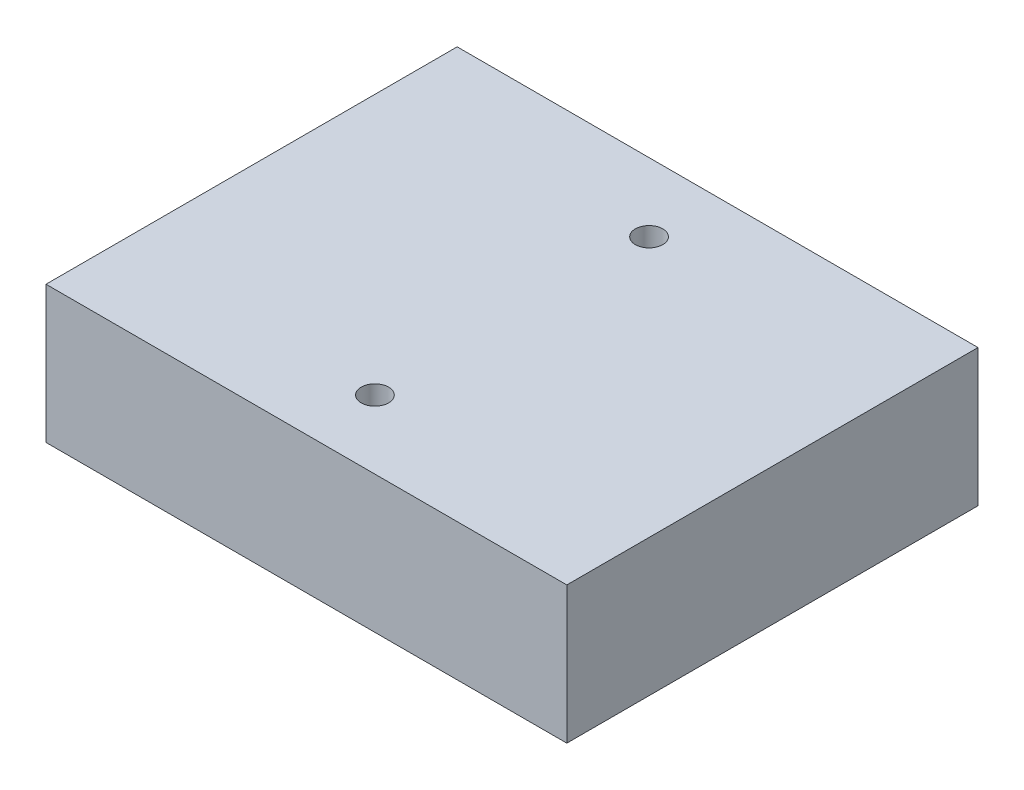
ISO-10303-21;
HEADER;
FILE_DESCRIPTION(('STEP AP214'),'2;1');
FILE_NAME('part.step','',(''),(''),'','','');
FILE_SCHEMA(('AUTOMOTIVE_DESIGN { 1 0 10303 214 1 1 1 1 }'));
ENDSEC;
DATA;
#1=APPLICATION_CONTEXT('core data for automotive mechanical design processes');
#2=APPLICATION_PROTOCOL_DEFINITION('international standard','automotive_design',2000,#1);
#3=PRODUCT_CONTEXT('',#1,'mechanical');
#4=PRODUCT('Part','Part','',(#3));
#5=PRODUCT_RELATED_PRODUCT_CATEGORY('part','',(#4));
#6=PRODUCT_DEFINITION_FORMATION('','',#4);
#7=PRODUCT_DEFINITION_CONTEXT('part definition',#1,'design');
#8=PRODUCT_DEFINITION('design','',#6,#7);
#9=PRODUCT_DEFINITION_SHAPE('','',#8);
#10=(LENGTH_UNIT() NAMED_UNIT(*) SI_UNIT(.MILLI.,.METRE.));
#11=(NAMED_UNIT(*) PLANE_ANGLE_UNIT() SI_UNIT($,.RADIAN.));
#12=(NAMED_UNIT(*) SI_UNIT($,.STERADIAN.) SOLID_ANGLE_UNIT());
#13=UNCERTAINTY_MEASURE_WITH_UNIT(LENGTH_MEASURE(1.E-05),#10,'distance_accuracy_value','');
#14=(GEOMETRIC_REPRESENTATION_CONTEXT(3) GLOBAL_UNCERTAINTY_ASSIGNED_CONTEXT((#13)) GLOBAL_UNIT_ASSIGNED_CONTEXT((#10,
#11,#12)) REPRESENTATION_CONTEXT('',''));
#15=CARTESIAN_POINT('',(0.,0.,0.));
#16=DIRECTION('',(0.,0.,1.));
#17=DIRECTION('',(1.,0.,0.));
#18=AXIS2_PLACEMENT_3D('',#15,#16,#17);
#19=CARTESIAN_POINT('',(0.,20.,0.));
#20=DIRECTION('',(0.,1.,0.));
#21=DIRECTION('',(0.,0.,1.));
#22=AXIS2_PLACEMENT_3D('',#19,#20,#21);
#23=PLANE('',#22);
#24=CARTESIAN_POINT('',(65.5142028985507,20.,-8.75130434782607));
#25=DIRECTION('',(0.,1.,0.));
#26=DIRECTION('',(0.,0.,1.));
#27=AXIS2_PLACEMENT_3D('',#24,#25,#26);
#28=CIRCLE('',#27,2.);
#29=CARTESIAN_POINT('',(65.5142028985507,20.,-6.75130434782607));
#30=VERTEX_POINT('',#29);
#31=EDGE_CURVE('E101',#30,#30,#28,.T.);
#32=ORIENTED_EDGE('',*,*,#31,.F.);
#33=EDGE_LOOP('',(#32));
#34=FACE_BOUND('',#33,.T.);
#35=DIRECTION('',(0.,0.,1.));
#36=VECTOR('',#35,1.);
#37=CARTESIAN_POINT('',(27.5142028985507,20.,-58.7513043478261));
#38=LINE('',#37,#36);
#39=CARTESIAN_POINT('',(27.5142028985507,20.,-58.7513043478261));
#40=VERTEX_POINT('',#39);
#41=CARTESIAN_POINT('',(27.5142028985507,20.,1.24869565217393));
#42=VERTEX_POINT('',#41);
#43=EDGE_CURVE('E86',#40,#42,#38,.T.);
#44=ORIENTED_EDGE('',*,*,#43,.T.);
#45=DIRECTION('',(1.,0.,0.));
#46=VECTOR('',#45,1.);
#47=CARTESIAN_POINT('',(27.5142028985507,20.,1.24869565217393));
#48=LINE('',#47,#46);
#49=CARTESIAN_POINT('',(103.514202898551,20.,1.24869565217393));
#50=VERTEX_POINT('',#49);
#51=EDGE_CURVE('E81',#42,#50,#48,.T.);
#52=ORIENTED_EDGE('',*,*,#51,.T.);
#53=DIRECTION('',(0.,0.,-1.));
#54=VECTOR('',#53,1.);
#55=CARTESIAN_POINT('',(103.514202898551,20.,-58.7513043478261));
#56=LINE('',#55,#54);
#57=CARTESIAN_POINT('',(103.514202898551,20.,-58.7513043478261));
#58=VERTEX_POINT('',#57);
#59=EDGE_CURVE('E84',#50,#58,#56,.T.);
#60=ORIENTED_EDGE('',*,*,#59,.T.);
#61=DIRECTION('',(-1.,0.,0.));
#62=VECTOR('',#61,1.);
#63=CARTESIAN_POINT('',(27.5142028985507,20.,-58.7513043478261));
#64=LINE('',#63,#62);
#65=EDGE_CURVE('E51',#58,#40,#64,.T.);
#66=ORIENTED_EDGE('',*,*,#65,.T.);
#67=EDGE_LOOP('',(#44,#52,#60,#66));
#68=FACE_BOUND('',#67,.T.);
#69=CARTESIAN_POINT('',(65.5142028985507,20.,-48.7513043478261));
#70=DIRECTION('',(0.,1.,0.));
#71=DIRECTION('',(0.,0.,1.));
#72=AXIS2_PLACEMENT_3D('',#69,#70,#71);
#73=CIRCLE('',#72,2.);
#74=CARTESIAN_POINT('',(65.5142028985507,20.,-46.7513043478261));
#75=VERTEX_POINT('',#74);
#76=EDGE_CURVE('E116',#75,#75,#73,.T.);
#77=ORIENTED_EDGE('',*,*,#76,.F.);
#78=EDGE_LOOP('',(#77));
#79=FACE_BOUND('',#78,.T.);
#80=ADVANCED_FACE('F34',(#34,#68,#79),#23,.T.);
#81=CARTESIAN_POINT('',(0.,0.,0.));
#82=DIRECTION('',(0.,1.,0.));
#83=DIRECTION('',(0.,0.,1.));
#84=AXIS2_PLACEMENT_3D('',#81,#82,#83);
#85=PLANE('',#84);
#86=DIRECTION('',(0.,0.,1.));
#87=VECTOR('',#86,1.);
#88=CARTESIAN_POINT('',(27.5142028985507,0.,-58.7513043478261));
#89=LINE('',#88,#87);
#90=CARTESIAN_POINT('',(27.5142028985507,0.,-58.7513043478261));
#91=VERTEX_POINT('',#90);
#92=CARTESIAN_POINT('',(27.5142028985507,0.,1.24869565217393));
#93=VERTEX_POINT('',#92);
#94=EDGE_CURVE('E98',#91,#93,#89,.T.);
#95=ORIENTED_EDGE('',*,*,#94,.F.);
#96=DIRECTION('',(-1.,0.,0.));
#97=VECTOR('',#96,1.);
#98=CARTESIAN_POINT('',(27.5142028985507,0.,-58.7513043478261));
#99=LINE('',#98,#97);
#100=CARTESIAN_POINT('',(103.514202898551,0.,-58.7513043478261));
#101=VERTEX_POINT('',#100);
#102=EDGE_CURVE('E74',#101,#91,#99,.T.);
#103=ORIENTED_EDGE('',*,*,#102,.F.);
#104=DIRECTION('',(0.,0.,-1.));
#105=VECTOR('',#104,1.);
#106=CARTESIAN_POINT('',(103.514202898551,0.,-58.7513043478261));
#107=LINE('',#106,#105);
#108=CARTESIAN_POINT('',(103.514202898551,0.,1.24869565217393));
#109=VERTEX_POINT('',#108);
#110=EDGE_CURVE('E68',#109,#101,#107,.T.);
#111=ORIENTED_EDGE('',*,*,#110,.F.);
#112=DIRECTION('',(1.,0.,0.));
#113=VECTOR('',#112,1.);
#114=CARTESIAN_POINT('',(27.5142028985507,0.,1.24869565217393));
#115=LINE('',#114,#113);
#116=EDGE_CURVE('E90',#93,#109,#115,.T.);
#117=ORIENTED_EDGE('',*,*,#116,.F.);
#118=EDGE_LOOP('',(#95,#103,#111,#117));
#119=FACE_BOUND('',#118,.T.);
#120=CARTESIAN_POINT('',(65.5142028985507,0.,-8.75130434782607));
#121=DIRECTION('',(0.,1.,0.));
#122=DIRECTION('',(0.,0.,1.));
#123=AXIS2_PLACEMENT_3D('',#120,#121,#122);
#124=CIRCLE('',#123,2.);
#125=CARTESIAN_POINT('',(65.5142028985507,0.,-6.75130434782607));
#126=VERTEX_POINT('',#125);
#127=EDGE_CURVE('E113',#126,#126,#124,.T.);
#128=ORIENTED_EDGE('',*,*,#127,.T.);
#129=EDGE_LOOP('',(#128));
#130=FACE_BOUND('',#129,.T.);
#131=CARTESIAN_POINT('',(65.5142028985507,0.,-48.7513043478261));
#132=DIRECTION('',(0.,1.,0.));
#133=DIRECTION('',(0.,0.,1.));
#134=AXIS2_PLACEMENT_3D('',#131,#132,#133);
#135=CIRCLE('',#134,2.);
#136=CARTESIAN_POINT('',(65.5142028985507,0.,-46.7513043478261));
#137=VERTEX_POINT('',#136);
#138=EDGE_CURVE('E119',#137,#137,#135,.T.);
#139=ORIENTED_EDGE('',*,*,#138,.T.);
#140=EDGE_LOOP('',(#139));
#141=FACE_BOUND('',#140,.T.);
#142=ADVANCED_FACE('F109',(#119,#130,#141),#85,.F.);
#143=CARTESIAN_POINT('',(27.5142028985507,20.,-58.7513043478261));
#144=DIRECTION('',(1.,0.,0.));
#145=DIRECTION('',(0.,0.,-1.));
#146=AXIS2_PLACEMENT_3D('',#143,#144,#145);
#147=PLANE('',#146);
#148=ORIENTED_EDGE('',*,*,#94,.T.);
#149=DIRECTION('',(0.,-1.,0.));
#150=VECTOR('',#149,1.);
#151=CARTESIAN_POINT('',(27.5142028985507,20.,1.24869565217393));
#152=LINE('',#151,#150);
#153=EDGE_CURVE('E11',#42,#93,#152,.T.);
#154=ORIENTED_EDGE('',*,*,#153,.F.);
#155=ORIENTED_EDGE('',*,*,#43,.F.);
#156=DIRECTION('',(0.,-1.,0.));
#157=VECTOR('',#156,1.);
#158=CARTESIAN_POINT('',(27.5142028985507,20.,-58.7513043478261));
#159=LINE('',#158,#157);
#160=EDGE_CURVE('E94',#40,#91,#159,.T.);
#161=ORIENTED_EDGE('',*,*,#160,.T.);
#162=EDGE_LOOP('',(#148,#154,#155,#161));
#163=FACE_BOUND('',#162,.T.);
#164=ADVANCED_FACE('F36',(#163),#147,.F.);
#165=CARTESIAN_POINT('',(27.5142028985507,20.,1.24869565217393));
#166=DIRECTION('',(0.,0.,-1.));
#167=DIRECTION('',(-1.,0.,0.));
#168=AXIS2_PLACEMENT_3D('',#165,#166,#167);
#169=PLANE('',#168);
#170=ORIENTED_EDGE('',*,*,#116,.T.);
#171=DIRECTION('',(0.,-1.,0.));
#172=VECTOR('',#171,1.);
#173=CARTESIAN_POINT('',(103.514202898551,20.,1.24869565217393));
#174=LINE('',#173,#172);
#175=EDGE_CURVE('E43',#50,#109,#174,.T.);
#176=ORIENTED_EDGE('',*,*,#175,.F.);
#177=ORIENTED_EDGE('',*,*,#51,.F.);
#178=ORIENTED_EDGE('',*,*,#153,.T.);
#179=EDGE_LOOP('',(#170,#176,#177,#178));
#180=FACE_BOUND('',#179,.T.);
#181=ADVANCED_FACE('F89',(#180),#169,.F.);
#182=CARTESIAN_POINT('',(103.514202898551,20.,-58.7513043478261));
#183=DIRECTION('',(-1.,0.,0.));
#184=DIRECTION('',(0.,0.,1.));
#185=AXIS2_PLACEMENT_3D('',#182,#183,#184);
#186=PLANE('',#185);
#187=ORIENTED_EDGE('',*,*,#110,.T.);
#188=DIRECTION('',(0.,-1.,0.));
#189=VECTOR('',#188,1.);
#190=CARTESIAN_POINT('',(103.514202898551,20.,-58.7513043478261));
#191=LINE('',#190,#189);
#192=EDGE_CURVE('E91',#58,#101,#191,.T.);
#193=ORIENTED_EDGE('',*,*,#192,.F.);
#194=ORIENTED_EDGE('',*,*,#59,.F.);
#195=ORIENTED_EDGE('',*,*,#175,.T.);
#196=EDGE_LOOP('',(#187,#193,#194,#195));
#197=FACE_BOUND('',#196,.T.);
#198=ADVANCED_FACE('F92',(#197),#186,.F.);
#199=CARTESIAN_POINT('',(27.5142028985507,20.,-58.7513043478261));
#200=DIRECTION('',(0.,0.,1.));
#201=DIRECTION('',(1.,0.,0.));
#202=AXIS2_PLACEMENT_3D('',#199,#200,#201);
#203=PLANE('',#202);
#204=ORIENTED_EDGE('',*,*,#102,.T.);
#205=ORIENTED_EDGE('',*,*,#160,.F.);
#206=ORIENTED_EDGE('',*,*,#65,.F.);
#207=ORIENTED_EDGE('',*,*,#192,.T.);
#208=EDGE_LOOP('',(#204,#205,#206,#207));
#209=FACE_BOUND('',#208,.T.);
#210=ADVANCED_FACE('F106',(#209),#203,.F.);
#211=CARTESIAN_POINT('',(65.5142028985507,20.,-8.75130434782607));
#212=DIRECTION('',(0.,-1.,0.));
#213=DIRECTION('',(0.,0.,-1.));
#214=AXIS2_PLACEMENT_3D('',#211,#212,#213);
#215=CYLINDRICAL_SURFACE('',#214,2.);
#216=ORIENTED_EDGE('',*,*,#31,.T.);
#217=EDGE_LOOP('',(#216));
#218=FACE_BOUND('',#217,.T.);
#219=ORIENTED_EDGE('',*,*,#127,.F.);
#220=EDGE_LOOP('',(#219));
#221=FACE_BOUND('',#220,.T.);
#222=ADVANCED_FACE('F136',(#218,#221),#215,.F.);
#223=CARTESIAN_POINT('',(65.5142028985507,20.,-48.7513043478261));
#224=DIRECTION('',(0.,-1.,0.));
#225=DIRECTION('',(0.,0.,-1.));
#226=AXIS2_PLACEMENT_3D('',#223,#224,#225);
#227=CYLINDRICAL_SURFACE('',#226,2.);
#228=ORIENTED_EDGE('',*,*,#76,.T.);
#229=EDGE_LOOP('',(#228));
#230=FACE_BOUND('',#229,.T.);
#231=ORIENTED_EDGE('',*,*,#138,.F.);
#232=EDGE_LOOP('',(#231));
#233=FACE_BOUND('',#232,.T.);
#234=ADVANCED_FACE('F125',(#230,#233),#227,.F.);
#235=CLOSED_SHELL('',(#80,#142,#164,#181,#198,#210,#222,#234));
#236=MANIFOLD_SOLID_BREP('B2',#235);
#237=ADVANCED_BREP_SHAPE_REPRESENTATION('',(#18,#236),#14);
#238=SHAPE_DEFINITION_REPRESENTATION(#9,#237);
ENDSEC;
END-ISO-10303-21;
